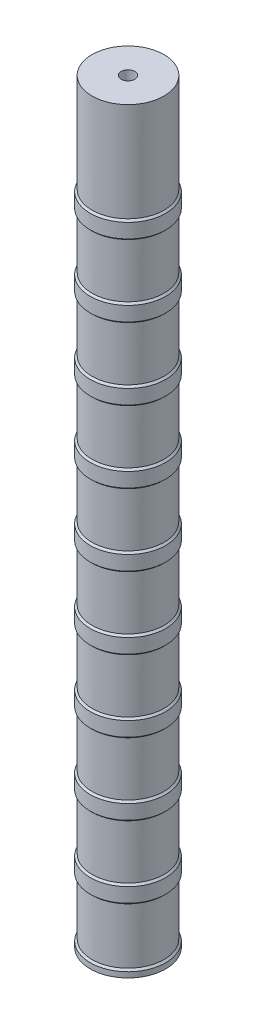
ISO-10303-21;
HEADER;
FILE_DESCRIPTION(('STEP AP214'),'2;1');
FILE_NAME('part.step','',(''),(''),'','','');
FILE_SCHEMA(('AUTOMOTIVE_DESIGN { 1 0 10303 214 1 1 1 1 }'));
ENDSEC;
DATA;
#1=APPLICATION_CONTEXT('core data for automotive mechanical design processes');
#2=APPLICATION_PROTOCOL_DEFINITION('international standard','automotive_design',2000,#1);
#3=PRODUCT_CONTEXT('',#1,'mechanical');
#4=PRODUCT('Part','Part','',(#3));
#5=PRODUCT_RELATED_PRODUCT_CATEGORY('part','',(#4));
#6=PRODUCT_DEFINITION_FORMATION('','',#4);
#7=PRODUCT_DEFINITION_CONTEXT('part definition',#1,'design');
#8=PRODUCT_DEFINITION('design','',#6,#7);
#9=PRODUCT_DEFINITION_SHAPE('','',#8);
#10=(LENGTH_UNIT() NAMED_UNIT(*) SI_UNIT(.MILLI.,.METRE.));
#11=(NAMED_UNIT(*) PLANE_ANGLE_UNIT() SI_UNIT($,.RADIAN.));
#12=(NAMED_UNIT(*) SI_UNIT($,.STERADIAN.) SOLID_ANGLE_UNIT());
#13=UNCERTAINTY_MEASURE_WITH_UNIT(LENGTH_MEASURE(1.E-05),#10,'distance_accuracy_value','');
#14=(GEOMETRIC_REPRESENTATION_CONTEXT(3) GLOBAL_UNCERTAINTY_ASSIGNED_CONTEXT((#13)) GLOBAL_UNIT_ASSIGNED_CONTEXT((#10,
#11,#12)) REPRESENTATION_CONTEXT('',''));
#15=CARTESIAN_POINT('',(0.,0.,0.));
#16=DIRECTION('',(0.,0.,1.));
#17=DIRECTION('',(1.,0.,0.));
#18=AXIS2_PLACEMENT_3D('',#15,#16,#17);
#19=CARTESIAN_POINT('',(0.,210.,0.));
#20=DIRECTION('',(0.,-1.,0.));
#21=DIRECTION('',(0.,0.,-1.));
#22=AXIS2_PLACEMENT_3D('',#19,#20,#21);
#23=CYLINDRICAL_SURFACE('',#22,10.);
#24=CARTESIAN_POINT('',(0.,1.99999999999997,0.));
#25=DIRECTION('',(0.,-1.,0.));
#26=DIRECTION('',(0.,0.,-1.));
#27=AXIS2_PLACEMENT_3D('',#24,#25,#26);
#28=CIRCLE('',#27,10.);
#29=CARTESIAN_POINT('',(0.,1.99999999999997,-10.));
#30=VERTEX_POINT('',#29);
#31=EDGE_CURVE('E10',#30,#30,#28,.F.);
#32=ORIENTED_EDGE('',*,*,#31,.T.);
#33=EDGE_LOOP('',(#32));
#34=FACE_BOUND('',#33,.T.);
#35=CARTESIAN_POINT('',(0.,17.5,0.));
#36=DIRECTION('',(0.,-1.,0.));
#37=DIRECTION('',(0.,0.,-1.));
#38=AXIS2_PLACEMENT_3D('',#35,#36,#37);
#39=CIRCLE('',#38,10.);
#40=CARTESIAN_POINT('',(0.,17.5,-10.));
#41=VERTEX_POINT('',#40);
#42=EDGE_CURVE('E54',#41,#41,#39,.T.);
#43=ORIENTED_EDGE('',*,*,#42,.T.);
#44=EDGE_LOOP('',(#43));
#45=FACE_BOUND('',#44,.T.);
#46=ADVANCED_FACE('F38',(#34,#45),#23,.T.);
#47=CARTESIAN_POINT('',(0.,10.,0.));
#48=DIRECTION('',(0.,-1.,0.));
#49=DIRECTION('',(0.,0.,-1.));
#50=AXIS2_PLACEMENT_3D('',#47,#48,#49);
#51=CYLINDRICAL_SURFACE('',#50,5.2);
#52=CARTESIAN_POINT('',(0.,10.,0.));
#53=DIRECTION('',(0.,-1.,0.));
#54=DIRECTION('',(0.,0.,-1.));
#55=AXIS2_PLACEMENT_3D('',#52,#53,#54);
#56=CIRCLE('',#55,5.2);
#57=CARTESIAN_POINT('',(0.,10.,-5.2));
#58=VERTEX_POINT('',#57);
#59=EDGE_CURVE('E60',#58,#58,#56,.T.);
#60=ORIENTED_EDGE('',*,*,#59,.F.);
#61=EDGE_LOOP('',(#60));
#62=FACE_BOUND('',#61,.T.);
#63=CARTESIAN_POINT('',(0.,1.5,0.));
#64=DIRECTION('',(0.,-1.,0.));
#65=DIRECTION('',(0.,0.,-1.));
#66=AXIS2_PLACEMENT_3D('',#63,#64,#65);
#67=CIRCLE('',#66,5.2);
#68=CARTESIAN_POINT('',(0.,1.5,-5.2));
#69=VERTEX_POINT('',#68);
#70=EDGE_CURVE('E46',#69,#69,#67,.F.);
#71=ORIENTED_EDGE('',*,*,#70,.F.);
#72=EDGE_LOOP('',(#71));
#73=FACE_BOUND('',#72,.T.);
#74=ADVANCED_FACE('F211',(#62,#73),#51,.F.);
#75=CARTESIAN_POINT('',(0.,0.,0.));
#76=DIRECTION('',(0.,1.,0.));
#77=DIRECTION('',(0.,0.,1.));
#78=AXIS2_PLACEMENT_3D('',#75,#76,#77);
#79=CYLINDRICAL_SURFACE('',#78,1.9);
#80=CARTESIAN_POINT('',(0.,210.,0.));
#81=DIRECTION('',(0.,1.,0.));
#82=DIRECTION('',(0.,0.,1.));
#83=AXIS2_PLACEMENT_3D('',#80,#81,#82);
#84=CIRCLE('',#83,1.9);
#85=CARTESIAN_POINT('',(0.,210.,1.9));
#86=VERTEX_POINT('',#85);
#87=EDGE_CURVE('E59',#86,#86,#84,.T.);
#88=ORIENTED_EDGE('',*,*,#87,.T.);
#89=EDGE_LOOP('',(#88));
#90=FACE_BOUND('',#89,.T.);
#91=CARTESIAN_POINT('',(0.,10.,0.));
#92=DIRECTION('',(0.,-1.,0.));
#93=DIRECTION('',(0.,0.,-1.));
#94=AXIS2_PLACEMENT_3D('',#91,#92,#93);
#95=CIRCLE('',#94,1.9);
#96=CARTESIAN_POINT('',(0.,10.,-1.9));
#97=VERTEX_POINT('',#96);
#98=EDGE_CURVE('E57',#97,#97,#95,.F.);
#99=ORIENTED_EDGE('',*,*,#98,.F.);
#100=EDGE_LOOP('',(#99));
#101=FACE_BOUND('',#100,.T.);
#102=ADVANCED_FACE('F218',(#90,#101),#79,.F.);
#103=CARTESIAN_POINT('',(0.,162.5,0.));
#104=DIRECTION('',(0.,-1.,0.));
#105=DIRECTION('',(0.,0.,-1.));
#106=AXIS2_PLACEMENT_3D('',#103,#104,#105);
#107=CIRCLE('',#106,10.);
#108=CARTESIAN_POINT('',(0.,162.5,-10.));
#109=VERTEX_POINT('',#108);
#110=EDGE_CURVE('E118',#109,#109,#107,.F.);
#111=ORIENTED_EDGE('',*,*,#110,.T.);
#112=EDGE_LOOP('',(#111));
#113=FACE_BOUND('',#112,.T.);
#114=CARTESIAN_POINT('',(0.,177.5,0.));
#115=DIRECTION('',(0.,-1.,0.));
#116=DIRECTION('',(0.,0.,-1.));
#117=AXIS2_PLACEMENT_3D('',#114,#115,#116);
#118=CIRCLE('',#117,10.);
#119=CARTESIAN_POINT('',(0.,177.5,-10.));
#120=VERTEX_POINT('',#119);
#121=EDGE_CURVE('E109',#120,#120,#118,.T.);
#122=ORIENTED_EDGE('',*,*,#121,.T.);
#123=EDGE_LOOP('',(#122));
#124=FACE_BOUND('',#123,.T.);
#125=ADVANCED_FACE('F213',(#113,#124),#23,.T.);
#126=CARTESIAN_POINT('',(0.,142.5,0.));
#127=DIRECTION('',(0.,-1.,0.));
#128=DIRECTION('',(0.,0.,-1.));
#129=AXIS2_PLACEMENT_3D('',#126,#127,#128);
#130=CIRCLE('',#129,10.);
#131=CARTESIAN_POINT('',(0.,142.5,-10.));
#132=VERTEX_POINT('',#131);
#133=EDGE_CURVE('E130',#132,#132,#130,.F.);
#134=ORIENTED_EDGE('',*,*,#133,.T.);
#135=EDGE_LOOP('',(#134));
#136=FACE_BOUND('',#135,.T.);
#137=CARTESIAN_POINT('',(0.,157.5,0.));
#138=DIRECTION('',(0.,-1.,0.));
#139=DIRECTION('',(0.,0.,-1.));
#140=AXIS2_PLACEMENT_3D('',#137,#138,#139);
#141=CIRCLE('',#140,10.);
#142=CARTESIAN_POINT('',(0.,157.5,-10.));
#143=VERTEX_POINT('',#142);
#144=EDGE_CURVE('E121',#143,#143,#141,.T.);
#145=ORIENTED_EDGE('',*,*,#144,.T.);
#146=EDGE_LOOP('',(#145));
#147=FACE_BOUND('',#146,.T.);
#148=ADVANCED_FACE('F224',(#136,#147),#23,.T.);
#149=CARTESIAN_POINT('',(0.,122.5,0.));
#150=DIRECTION('',(0.,-1.,0.));
#151=DIRECTION('',(0.,0.,-1.));
#152=AXIS2_PLACEMENT_3D('',#149,#150,#151);
#153=CIRCLE('',#152,10.);
#154=CARTESIAN_POINT('',(0.,122.5,-10.));
#155=VERTEX_POINT('',#154);
#156=EDGE_CURVE('E142',#155,#155,#153,.F.);
#157=ORIENTED_EDGE('',*,*,#156,.T.);
#158=EDGE_LOOP('',(#157));
#159=FACE_BOUND('',#158,.T.);
#160=CARTESIAN_POINT('',(0.,137.5,0.));
#161=DIRECTION('',(0.,-1.,0.));
#162=DIRECTION('',(0.,0.,-1.));
#163=AXIS2_PLACEMENT_3D('',#160,#161,#162);
#164=CIRCLE('',#163,10.);
#165=CARTESIAN_POINT('',(0.,137.5,-10.));
#166=VERTEX_POINT('',#165);
#167=EDGE_CURVE('E133',#166,#166,#164,.T.);
#168=ORIENTED_EDGE('',*,*,#167,.T.);
#169=EDGE_LOOP('',(#168));
#170=FACE_BOUND('',#169,.T.);
#171=ADVANCED_FACE('F683',(#159,#170),#23,.T.);
#172=CARTESIAN_POINT('',(0.,102.5,0.));
#173=DIRECTION('',(0.,-1.,0.));
#174=DIRECTION('',(0.,0.,-1.));
#175=AXIS2_PLACEMENT_3D('',#172,#173,#174);
#176=CIRCLE('',#175,10.);
#177=CARTESIAN_POINT('',(0.,102.5,-10.));
#178=VERTEX_POINT('',#177);
#179=EDGE_CURVE('E163',#178,#178,#176,.F.);
#180=ORIENTED_EDGE('',*,*,#179,.T.);
#181=EDGE_LOOP('',(#180));
#182=FACE_BOUND('',#181,.T.);
#183=CARTESIAN_POINT('',(0.,117.5,0.));
#184=DIRECTION('',(0.,-1.,0.));
#185=DIRECTION('',(0.,0.,-1.));
#186=AXIS2_PLACEMENT_3D('',#183,#184,#185);
#187=CIRCLE('',#186,10.);
#188=CARTESIAN_POINT('',(0.,117.5,-10.));
#189=VERTEX_POINT('',#188);
#190=EDGE_CURVE('E145',#189,#189,#187,.T.);
#191=ORIENTED_EDGE('',*,*,#190,.T.);
#192=EDGE_LOOP('',(#191));
#193=FACE_BOUND('',#192,.T.);
#194=ADVANCED_FACE('F673',(#182,#193),#23,.T.);
#195=CARTESIAN_POINT('',(0.,62.5,0.));
#196=DIRECTION('',(0.,-1.,0.));
#197=DIRECTION('',(0.,0.,-1.));
#198=AXIS2_PLACEMENT_3D('',#195,#196,#197);
#199=CIRCLE('',#198,10.);
#200=CARTESIAN_POINT('',(0.,62.5,-10.));
#201=VERTEX_POINT('',#200);
#202=EDGE_CURVE('E82',#201,#201,#199,.F.);
#203=ORIENTED_EDGE('',*,*,#202,.T.);
#204=EDGE_LOOP('',(#203));
#205=FACE_BOUND('',#204,.T.);
#206=CARTESIAN_POINT('',(0.,77.5,0.));
#207=DIRECTION('',(0.,-1.,0.));
#208=DIRECTION('',(0.,0.,-1.));
#209=AXIS2_PLACEMENT_3D('',#206,#207,#208);
#210=CIRCLE('',#209,10.);
#211=CARTESIAN_POINT('',(0.,77.5,-10.));
#212=VERTEX_POINT('',#211);
#213=EDGE_CURVE('E97',#212,#212,#210,.T.);
#214=ORIENTED_EDGE('',*,*,#213,.T.);
#215=EDGE_LOOP('',(#214));
#216=FACE_BOUND('',#215,.T.);
#217=ADVANCED_FACE('F265',(#205,#216),#23,.T.);
#218=CARTESIAN_POINT('',(0.,42.5,0.));
#219=DIRECTION('',(0.,-1.,0.));
#220=DIRECTION('',(0.,0.,-1.));
#221=AXIS2_PLACEMENT_3D('',#218,#219,#220);
#222=CIRCLE('',#221,10.);
#223=CARTESIAN_POINT('',(0.,42.5,-10.));
#224=VERTEX_POINT('',#223);
#225=EDGE_CURVE('E70',#224,#224,#222,.F.);
#226=ORIENTED_EDGE('',*,*,#225,.T.);
#227=EDGE_LOOP('',(#226));
#228=FACE_BOUND('',#227,.T.);
#229=CARTESIAN_POINT('',(0.,57.5,0.));
#230=DIRECTION('',(0.,-1.,0.));
#231=DIRECTION('',(0.,0.,-1.));
#232=AXIS2_PLACEMENT_3D('',#229,#230,#231);
#233=CIRCLE('',#232,10.);
#234=CARTESIAN_POINT('',(0.,57.5,-10.));
#235=VERTEX_POINT('',#234);
#236=EDGE_CURVE('E85',#235,#235,#233,.T.);
#237=ORIENTED_EDGE('',*,*,#236,.T.);
#238=EDGE_LOOP('',(#237));
#239=FACE_BOUND('',#238,.T.);
#240=ADVANCED_FACE('F257',(#228,#239),#23,.T.);
#241=CARTESIAN_POINT('',(0.,22.5,0.));
#242=DIRECTION('',(0.,-1.,0.));
#243=DIRECTION('',(0.,0.,-1.));
#244=AXIS2_PLACEMENT_3D('',#241,#242,#243);
#245=CIRCLE('',#244,10.);
#246=CARTESIAN_POINT('',(0.,22.5,-10.));
#247=VERTEX_POINT('',#246);
#248=EDGE_CURVE('E50',#247,#247,#245,.F.);
#249=ORIENTED_EDGE('',*,*,#248,.T.);
#250=EDGE_LOOP('',(#249));
#251=FACE_BOUND('',#250,.T.);
#252=CARTESIAN_POINT('',(0.,37.5,0.));
#253=DIRECTION('',(0.,-1.,0.));
#254=DIRECTION('',(0.,0.,-1.));
#255=AXIS2_PLACEMENT_3D('',#252,#253,#254);
#256=CIRCLE('',#255,10.);
#257=CARTESIAN_POINT('',(0.,37.5,-10.));
#258=VERTEX_POINT('',#257);
#259=EDGE_CURVE('E73',#258,#258,#256,.T.);
#260=ORIENTED_EDGE('',*,*,#259,.T.);
#261=EDGE_LOOP('',(#260));
#262=FACE_BOUND('',#261,.T.);
#263=ADVANCED_FACE('F245',(#251,#262),#23,.T.);
#264=CARTESIAN_POINT('',(0.,21.5,0.));
#265=DIRECTION('',(0.,-1.,0.));
#266=DIRECTION('',(0.,0.,-1.));
#267=AXIS2_PLACEMENT_3D('',#264,#265,#266);
#268=CONICAL_SURFACE('',#267,11.,0.785398163397457);
#269=ORIENTED_EDGE('',*,*,#248,.F.);
#270=EDGE_LOOP('',(#269));
#271=FACE_BOUND('',#270,.T.);
#272=CARTESIAN_POINT('',(0.,22.,0.));
#273=DIRECTION('',(0.,-1.,0.));
#274=DIRECTION('',(0.,0.,-1.));
#275=AXIS2_PLACEMENT_3D('',#272,#273,#274);
#276=CIRCLE('',#275,10.5);
#277=CARTESIAN_POINT('',(0.,22.,-10.5));
#278=VERTEX_POINT('',#277);
#279=EDGE_CURVE('E64',#278,#278,#276,.T.);
#280=ORIENTED_EDGE('',*,*,#279,.F.);
#281=EDGE_LOOP('',(#280));
#282=FACE_BOUND('',#281,.T.);
#283=ADVANCED_FACE('F256',(#271,#282),#268,.T.);
#284=CARTESIAN_POINT('',(0.,17.5,0.));
#285=DIRECTION('',(0.,1.,0.));
#286=DIRECTION('',(0.,0.,1.));
#287=AXIS2_PLACEMENT_3D('',#284,#285,#286);
#288=CONICAL_SURFACE('',#287,10.,0.785398163397445);
#289=CARTESIAN_POINT('',(0.,18.,0.));
#290=DIRECTION('',(0.,1.,0.));
#291=DIRECTION('',(0.,0.,1.));
#292=AXIS2_PLACEMENT_3D('',#289,#290,#291);
#293=CIRCLE('',#292,10.5);
#294=CARTESIAN_POINT('',(0.,18.,10.5));
#295=VERTEX_POINT('',#294);
#296=EDGE_CURVE('E67',#295,#295,#293,.T.);
#297=ORIENTED_EDGE('',*,*,#296,.F.);
#298=EDGE_LOOP('',(#297));
#299=FACE_BOUND('',#298,.T.);
#300=ORIENTED_EDGE('',*,*,#42,.F.);
#301=EDGE_LOOP('',(#300));
#302=FACE_BOUND('',#301,.T.);
#303=ADVANCED_FACE('F263',(#299,#302),#288,.T.);
#304=CARTESIAN_POINT('',(0.,18.5,0.));
#305=DIRECTION('',(0.,1.,0.));
#306=DIRECTION('',(0.,0.,1.));
#307=AXIS2_PLACEMENT_3D('',#304,#305,#306);
#308=CYLINDRICAL_SURFACE('',#307,10.5);
#309=ORIENTED_EDGE('',*,*,#296,.T.);
#310=EDGE_LOOP('',(#309));
#311=FACE_BOUND('',#310,.T.);
#312=ORIENTED_EDGE('',*,*,#279,.T.);
#313=EDGE_LOOP('',(#312));
#314=FACE_BOUND('',#313,.T.);
#315=ADVANCED_FACE('F284',(#311,#314),#308,.T.);
#316=CARTESIAN_POINT('',(0.,41.5,0.));
#317=DIRECTION('',(0.,-1.,0.));
#318=DIRECTION('',(0.,0.,-1.));
#319=AXIS2_PLACEMENT_3D('',#316,#317,#318);
#320=CONICAL_SURFACE('',#319,11.,0.785398163397457);
#321=ORIENTED_EDGE('',*,*,#225,.F.);
#322=EDGE_LOOP('',(#321));
#323=FACE_BOUND('',#322,.T.);
#324=CARTESIAN_POINT('',(0.,42.,0.));
#325=DIRECTION('',(0.,-1.,0.));
#326=DIRECTION('',(0.,0.,-1.));
#327=AXIS2_PLACEMENT_3D('',#324,#325,#326);
#328=CIRCLE('',#327,10.5);
#329=CARTESIAN_POINT('',(0.,42.,-10.5));
#330=VERTEX_POINT('',#329);
#331=EDGE_CURVE('E76',#330,#330,#328,.T.);
#332=ORIENTED_EDGE('',*,*,#331,.F.);
#333=EDGE_LOOP('',(#332));
#334=FACE_BOUND('',#333,.T.);
#335=ADVANCED_FACE('F274',(#323,#334),#320,.T.);
#336=CARTESIAN_POINT('',(0.,37.5,0.));
#337=DIRECTION('',(0.,1.,0.));
#338=DIRECTION('',(0.,0.,1.));
#339=AXIS2_PLACEMENT_3D('',#336,#337,#338);
#340=CONICAL_SURFACE('',#339,10.,0.785398163397445);
#341=CARTESIAN_POINT('',(0.,38.,0.));
#342=DIRECTION('',(0.,1.,0.));
#343=DIRECTION('',(0.,0.,1.));
#344=AXIS2_PLACEMENT_3D('',#341,#342,#343);
#345=CIRCLE('',#344,10.5);
#346=CARTESIAN_POINT('',(0.,38.,10.5));
#347=VERTEX_POINT('',#346);
#348=EDGE_CURVE('E79',#347,#347,#345,.T.);
#349=ORIENTED_EDGE('',*,*,#348,.F.);
#350=EDGE_LOOP('',(#349));
#351=FACE_BOUND('',#350,.T.);
#352=ORIENTED_EDGE('',*,*,#259,.F.);
#353=EDGE_LOOP('',(#352));
#354=FACE_BOUND('',#353,.T.);
#355=ADVANCED_FACE('F271',(#351,#354),#340,.T.);
#356=CARTESIAN_POINT('',(0.,38.5,0.));
#357=DIRECTION('',(0.,1.,0.));
#358=DIRECTION('',(0.,0.,1.));
#359=AXIS2_PLACEMENT_3D('',#356,#357,#358);
#360=CYLINDRICAL_SURFACE('',#359,10.5);
#361=ORIENTED_EDGE('',*,*,#348,.T.);
#362=EDGE_LOOP('',(#361));
#363=FACE_BOUND('',#362,.T.);
#364=ORIENTED_EDGE('',*,*,#331,.T.);
#365=EDGE_LOOP('',(#364));
#366=FACE_BOUND('',#365,.T.);
#367=ADVANCED_FACE('F273',(#363,#366),#360,.T.);
#368=CARTESIAN_POINT('',(0.,61.5,0.));
#369=DIRECTION('',(0.,-1.,0.));
#370=DIRECTION('',(0.,0.,-1.));
#371=AXIS2_PLACEMENT_3D('',#368,#369,#370);
#372=CONICAL_SURFACE('',#371,11.,0.785398163397457);
#373=ORIENTED_EDGE('',*,*,#202,.F.);
#374=EDGE_LOOP('',(#373));
#375=FACE_BOUND('',#374,.T.);
#376=CARTESIAN_POINT('',(0.,62.,0.));
#377=DIRECTION('',(0.,-1.,0.));
#378=DIRECTION('',(0.,0.,-1.));
#379=AXIS2_PLACEMENT_3D('',#376,#377,#378);
#380=CIRCLE('',#379,10.5);
#381=CARTESIAN_POINT('',(0.,62.,-10.5));
#382=VERTEX_POINT('',#381);
#383=EDGE_CURVE('E88',#382,#382,#380,.T.);
#384=ORIENTED_EDGE('',*,*,#383,.F.);
#385=EDGE_LOOP('',(#384));
#386=FACE_BOUND('',#385,.T.);
#387=ADVANCED_FACE('F281',(#375,#386),#372,.T.);
#388=CARTESIAN_POINT('',(0.,57.5,0.));
#389=DIRECTION('',(0.,1.,0.));
#390=DIRECTION('',(0.,0.,1.));
#391=AXIS2_PLACEMENT_3D('',#388,#389,#390);
#392=CONICAL_SURFACE('',#391,10.,0.785398163397445);
#393=CARTESIAN_POINT('',(0.,58.,0.));
#394=DIRECTION('',(0.,1.,0.));
#395=DIRECTION('',(0.,0.,1.));
#396=AXIS2_PLACEMENT_3D('',#393,#394,#395);
#397=CIRCLE('',#396,10.5);
#398=CARTESIAN_POINT('',(0.,58.,10.5));
#399=VERTEX_POINT('',#398);
#400=EDGE_CURVE('E91',#399,#399,#397,.T.);
#401=ORIENTED_EDGE('',*,*,#400,.F.);
#402=EDGE_LOOP('',(#401));
#403=FACE_BOUND('',#402,.T.);
#404=ORIENTED_EDGE('',*,*,#236,.F.);
#405=EDGE_LOOP('',(#404));
#406=FACE_BOUND('',#405,.T.);
#407=ADVANCED_FACE('F350',(#403,#406),#392,.T.);
#408=CARTESIAN_POINT('',(0.,58.5,0.));
#409=DIRECTION('',(0.,1.,0.));
#410=DIRECTION('',(0.,0.,1.));
#411=AXIS2_PLACEMENT_3D('',#408,#409,#410);
#412=CYLINDRICAL_SURFACE('',#411,10.5);
#413=ORIENTED_EDGE('',*,*,#400,.T.);
#414=EDGE_LOOP('',(#413));
#415=FACE_BOUND('',#414,.T.);
#416=ORIENTED_EDGE('',*,*,#383,.T.);
#417=EDGE_LOOP('',(#416));
#418=FACE_BOUND('',#417,.T.);
#419=ADVANCED_FACE('F360',(#415,#418),#412,.T.);
#420=CARTESIAN_POINT('',(0.,81.5,0.));
#421=DIRECTION('',(0.,-1.,0.));
#422=DIRECTION('',(0.,0.,-1.));
#423=AXIS2_PLACEMENT_3D('',#420,#421,#422);
#424=CONICAL_SURFACE('',#423,11.,0.785398163397457);
#425=CARTESIAN_POINT('',(0.,82.5,0.));
#426=DIRECTION('',(0.,-1.,0.));
#427=DIRECTION('',(0.,0.,-1.));
#428=AXIS2_PLACEMENT_3D('',#425,#426,#427);
#429=CIRCLE('',#428,10.);
#430=CARTESIAN_POINT('',(0.,82.5,-10.));
#431=VERTEX_POINT('',#430);
#432=EDGE_CURVE('E94',#431,#431,#429,.F.);
#433=ORIENTED_EDGE('',*,*,#432,.F.);
#434=EDGE_LOOP('',(#433));
#435=FACE_BOUND('',#434,.T.);
#436=CARTESIAN_POINT('',(0.,82.,0.));
#437=DIRECTION('',(0.,-1.,0.));
#438=DIRECTION('',(0.,0.,-1.));
#439=AXIS2_PLACEMENT_3D('',#436,#437,#438);
#440=CIRCLE('',#439,10.5);
#441=CARTESIAN_POINT('',(0.,82.,-10.5));
#442=VERTEX_POINT('',#441);
#443=EDGE_CURVE('E100',#442,#442,#440,.T.);
#444=ORIENTED_EDGE('',*,*,#443,.F.);
#445=EDGE_LOOP('',(#444));
#446=FACE_BOUND('',#445,.T.);
#447=ADVANCED_FACE('F371',(#435,#446),#424,.T.);
#448=CARTESIAN_POINT('',(0.,77.5,0.));
#449=DIRECTION('',(0.,1.,0.));
#450=DIRECTION('',(0.,0.,1.));
#451=AXIS2_PLACEMENT_3D('',#448,#449,#450);
#452=CONICAL_SURFACE('',#451,10.,0.785398163397445);
#453=CARTESIAN_POINT('',(0.,78.,0.));
#454=DIRECTION('',(0.,1.,0.));
#455=DIRECTION('',(0.,0.,1.));
#456=AXIS2_PLACEMENT_3D('',#453,#454,#455);
#457=CIRCLE('',#456,10.5);
#458=CARTESIAN_POINT('',(0.,78.,10.5));
#459=VERTEX_POINT('',#458);
#460=EDGE_CURVE('E103',#459,#459,#457,.T.);
#461=ORIENTED_EDGE('',*,*,#460,.F.);
#462=EDGE_LOOP('',(#461));
#463=FACE_BOUND('',#462,.T.);
#464=ORIENTED_EDGE('',*,*,#213,.F.);
#465=EDGE_LOOP('',(#464));
#466=FACE_BOUND('',#465,.T.);
#467=ADVANCED_FACE('F382',(#463,#466),#452,.T.);
#468=CARTESIAN_POINT('',(0.,78.5,0.));
#469=DIRECTION('',(0.,1.,0.));
#470=DIRECTION('',(0.,0.,1.));
#471=AXIS2_PLACEMENT_3D('',#468,#469,#470);
#472=CYLINDRICAL_SURFACE('',#471,10.5);
#473=ORIENTED_EDGE('',*,*,#460,.T.);
#474=EDGE_LOOP('',(#473));
#475=FACE_BOUND('',#474,.T.);
#476=ORIENTED_EDGE('',*,*,#443,.T.);
#477=EDGE_LOOP('',(#476));
#478=FACE_BOUND('',#477,.T.);
#479=ADVANCED_FACE('F393',(#475,#478),#472,.T.);
#480=CARTESIAN_POINT('',(0.,181.5,0.));
#481=DIRECTION('',(0.,-1.,0.));
#482=DIRECTION('',(0.,0.,-1.));
#483=AXIS2_PLACEMENT_3D('',#480,#481,#482);
#484=CONICAL_SURFACE('',#483,11.,0.785398163397457);
#485=CARTESIAN_POINT('',(0.,182.5,0.));
#486=DIRECTION('',(0.,-1.,0.));
#487=DIRECTION('',(0.,0.,-1.));
#488=AXIS2_PLACEMENT_3D('',#485,#486,#487);
#489=CIRCLE('',#488,10.);
#490=CARTESIAN_POINT('',(0.,182.5,-10.));
#491=VERTEX_POINT('',#490);
#492=EDGE_CURVE('E106',#491,#491,#489,.F.);
#493=ORIENTED_EDGE('',*,*,#492,.F.);
#494=EDGE_LOOP('',(#493));
#495=FACE_BOUND('',#494,.T.);
#496=CARTESIAN_POINT('',(0.,182.,0.));
#497=DIRECTION('',(0.,-1.,0.));
#498=DIRECTION('',(0.,0.,-1.));
#499=AXIS2_PLACEMENT_3D('',#496,#497,#498);
#500=CIRCLE('',#499,10.5);
#501=CARTESIAN_POINT('',(0.,182.,-10.5));
#502=VERTEX_POINT('',#501);
#503=EDGE_CURVE('E112',#502,#502,#500,.T.);
#504=ORIENTED_EDGE('',*,*,#503,.F.);
#505=EDGE_LOOP('',(#504));
#506=FACE_BOUND('',#505,.T.);
#507=ADVANCED_FACE('F404',(#495,#506),#484,.T.);
#508=CARTESIAN_POINT('',(0.,177.5,0.));
#509=DIRECTION('',(0.,1.,0.));
#510=DIRECTION('',(0.,0.,1.));
#511=AXIS2_PLACEMENT_3D('',#508,#509,#510);
#512=CONICAL_SURFACE('',#511,10.,0.785398163397445);
#513=CARTESIAN_POINT('',(0.,178.,0.));
#514=DIRECTION('',(0.,1.,0.));
#515=DIRECTION('',(0.,0.,1.));
#516=AXIS2_PLACEMENT_3D('',#513,#514,#515);
#517=CIRCLE('',#516,10.5);
#518=CARTESIAN_POINT('',(0.,178.,10.5));
#519=VERTEX_POINT('',#518);
#520=EDGE_CURVE('E115',#519,#519,#517,.T.);
#521=ORIENTED_EDGE('',*,*,#520,.F.);
#522=EDGE_LOOP('',(#521));
#523=FACE_BOUND('',#522,.T.);
#524=ORIENTED_EDGE('',*,*,#121,.F.);
#525=EDGE_LOOP('',(#524));
#526=FACE_BOUND('',#525,.T.);
#527=ADVANCED_FACE('F415',(#523,#526),#512,.T.);
#528=CARTESIAN_POINT('',(0.,178.5,0.));
#529=DIRECTION('',(0.,1.,0.));
#530=DIRECTION('',(0.,0.,1.));
#531=AXIS2_PLACEMENT_3D('',#528,#529,#530);
#532=CYLINDRICAL_SURFACE('',#531,10.5);
#533=ORIENTED_EDGE('',*,*,#520,.T.);
#534=EDGE_LOOP('',(#533));
#535=FACE_BOUND('',#534,.T.);
#536=ORIENTED_EDGE('',*,*,#503,.T.);
#537=EDGE_LOOP('',(#536));
#538=FACE_BOUND('',#537,.T.);
#539=ADVANCED_FACE('F426',(#535,#538),#532,.T.);
#540=CARTESIAN_POINT('',(0.,161.5,0.));
#541=DIRECTION('',(0.,-1.,0.));
#542=DIRECTION('',(0.,0.,-1.));
#543=AXIS2_PLACEMENT_3D('',#540,#541,#542);
#544=CONICAL_SURFACE('',#543,11.,0.785398163397457);
#545=ORIENTED_EDGE('',*,*,#110,.F.);
#546=EDGE_LOOP('',(#545));
#547=FACE_BOUND('',#546,.T.);
#548=CARTESIAN_POINT('',(0.,162.,0.));
#549=DIRECTION('',(0.,-1.,0.));
#550=DIRECTION('',(0.,0.,-1.));
#551=AXIS2_PLACEMENT_3D('',#548,#549,#550);
#552=CIRCLE('',#551,10.5);
#553=CARTESIAN_POINT('',(0.,162.,-10.5));
#554=VERTEX_POINT('',#553);
#555=EDGE_CURVE('E124',#554,#554,#552,.T.);
#556=ORIENTED_EDGE('',*,*,#555,.F.);
#557=EDGE_LOOP('',(#556));
#558=FACE_BOUND('',#557,.T.);
#559=ADVANCED_FACE('F437',(#547,#558),#544,.T.);
#560=CARTESIAN_POINT('',(0.,157.5,0.));
#561=DIRECTION('',(0.,1.,0.));
#562=DIRECTION('',(0.,0.,1.));
#563=AXIS2_PLACEMENT_3D('',#560,#561,#562);
#564=CONICAL_SURFACE('',#563,10.,0.785398163397445);
#565=CARTESIAN_POINT('',(0.,158.,0.));
#566=DIRECTION('',(0.,1.,0.));
#567=DIRECTION('',(0.,0.,1.));
#568=AXIS2_PLACEMENT_3D('',#565,#566,#567);
#569=CIRCLE('',#568,10.5);
#570=CARTESIAN_POINT('',(0.,158.,10.5));
#571=VERTEX_POINT('',#570);
#572=EDGE_CURVE('E127',#571,#571,#569,.T.);
#573=ORIENTED_EDGE('',*,*,#572,.F.);
#574=EDGE_LOOP('',(#573));
#575=FACE_BOUND('',#574,.T.);
#576=ORIENTED_EDGE('',*,*,#144,.F.);
#577=EDGE_LOOP('',(#576));
#578=FACE_BOUND('',#577,.T.);
#579=ADVANCED_FACE('F448',(#575,#578),#564,.T.);
#580=CARTESIAN_POINT('',(0.,158.5,0.));
#581=DIRECTION('',(0.,1.,0.));
#582=DIRECTION('',(0.,0.,1.));
#583=AXIS2_PLACEMENT_3D('',#580,#581,#582);
#584=CYLINDRICAL_SURFACE('',#583,10.5);
#585=ORIENTED_EDGE('',*,*,#572,.T.);
#586=EDGE_LOOP('',(#585));
#587=FACE_BOUND('',#586,.T.);
#588=ORIENTED_EDGE('',*,*,#555,.T.);
#589=EDGE_LOOP('',(#588));
#590=FACE_BOUND('',#589,.T.);
#591=ADVANCED_FACE('F459',(#587,#590),#584,.T.);
#592=CARTESIAN_POINT('',(0.,141.5,0.));
#593=DIRECTION('',(0.,-1.,0.));
#594=DIRECTION('',(0.,0.,-1.));
#595=AXIS2_PLACEMENT_3D('',#592,#593,#594);
#596=CONICAL_SURFACE('',#595,11.,0.785398163397457);
#597=ORIENTED_EDGE('',*,*,#133,.F.);
#598=EDGE_LOOP('',(#597));
#599=FACE_BOUND('',#598,.T.);
#600=CARTESIAN_POINT('',(0.,142.,0.));
#601=DIRECTION('',(0.,-1.,0.));
#602=DIRECTION('',(0.,0.,-1.));
#603=AXIS2_PLACEMENT_3D('',#600,#601,#602);
#604=CIRCLE('',#603,10.5);
#605=CARTESIAN_POINT('',(0.,142.,-10.5));
#606=VERTEX_POINT('',#605);
#607=EDGE_CURVE('E136',#606,#606,#604,.T.);
#608=ORIENTED_EDGE('',*,*,#607,.F.);
#609=EDGE_LOOP('',(#608));
#610=FACE_BOUND('',#609,.T.);
#611=ADVANCED_FACE('F470',(#599,#610),#596,.T.);
#612=CARTESIAN_POINT('',(0.,137.5,0.));
#613=DIRECTION('',(0.,1.,0.));
#614=DIRECTION('',(0.,0.,1.));
#615=AXIS2_PLACEMENT_3D('',#612,#613,#614);
#616=CONICAL_SURFACE('',#615,10.,0.785398163397445);
#617=CARTESIAN_POINT('',(0.,138.,0.));
#618=DIRECTION('',(0.,1.,0.));
#619=DIRECTION('',(0.,0.,1.));
#620=AXIS2_PLACEMENT_3D('',#617,#618,#619);
#621=CIRCLE('',#620,10.5);
#622=CARTESIAN_POINT('',(0.,138.,10.5));
#623=VERTEX_POINT('',#622);
#624=EDGE_CURVE('E139',#623,#623,#621,.T.);
#625=ORIENTED_EDGE('',*,*,#624,.F.);
#626=EDGE_LOOP('',(#625));
#627=FACE_BOUND('',#626,.T.);
#628=ORIENTED_EDGE('',*,*,#167,.F.);
#629=EDGE_LOOP('',(#628));
#630=FACE_BOUND('',#629,.T.);
#631=ADVANCED_FACE('F481',(#627,#630),#616,.T.);
#632=CARTESIAN_POINT('',(0.,138.5,0.));
#633=DIRECTION('',(0.,1.,0.));
#634=DIRECTION('',(0.,0.,1.));
#635=AXIS2_PLACEMENT_3D('',#632,#633,#634);
#636=CYLINDRICAL_SURFACE('',#635,10.5);
#637=ORIENTED_EDGE('',*,*,#624,.T.);
#638=EDGE_LOOP('',(#637));
#639=FACE_BOUND('',#638,.T.);
#640=ORIENTED_EDGE('',*,*,#607,.T.);
#641=EDGE_LOOP('',(#640));
#642=FACE_BOUND('',#641,.T.);
#643=ADVANCED_FACE('F492',(#639,#642),#636,.T.);
#644=CARTESIAN_POINT('',(0.,121.5,0.));
#645=DIRECTION('',(0.,-1.,0.));
#646=DIRECTION('',(0.,0.,-1.));
#647=AXIS2_PLACEMENT_3D('',#644,#645,#646);
#648=CONICAL_SURFACE('',#647,11.,0.785398163397457);
#649=ORIENTED_EDGE('',*,*,#156,.F.);
#650=EDGE_LOOP('',(#649));
#651=FACE_BOUND('',#650,.T.);
#652=CARTESIAN_POINT('',(0.,122.,0.));
#653=DIRECTION('',(0.,-1.,0.));
#654=DIRECTION('',(0.,0.,-1.));
#655=AXIS2_PLACEMENT_3D('',#652,#653,#654);
#656=CIRCLE('',#655,10.5);
#657=CARTESIAN_POINT('',(0.,122.,-10.5));
#658=VERTEX_POINT('',#657);
#659=EDGE_CURVE('E148',#658,#658,#656,.T.);
#660=ORIENTED_EDGE('',*,*,#659,.F.);
#661=EDGE_LOOP('',(#660));
#662=FACE_BOUND('',#661,.T.);
#663=ADVANCED_FACE('F503',(#651,#662),#648,.T.);
#664=CARTESIAN_POINT('',(0.,117.5,0.));
#665=DIRECTION('',(0.,1.,0.));
#666=DIRECTION('',(0.,0.,1.));
#667=AXIS2_PLACEMENT_3D('',#664,#665,#666);
#668=CONICAL_SURFACE('',#667,10.,0.785398163397445);
#669=CARTESIAN_POINT('',(0.,118.,0.));
#670=DIRECTION('',(0.,1.,0.));
#671=DIRECTION('',(0.,0.,1.));
#672=AXIS2_PLACEMENT_3D('',#669,#670,#671);
#673=CIRCLE('',#672,10.5);
#674=CARTESIAN_POINT('',(0.,118.,10.5));
#675=VERTEX_POINT('',#674);
#676=EDGE_CURVE('E151',#675,#675,#673,.T.);
#677=ORIENTED_EDGE('',*,*,#676,.F.);
#678=EDGE_LOOP('',(#677));
#679=FACE_BOUND('',#678,.T.);
#680=ORIENTED_EDGE('',*,*,#190,.F.);
#681=EDGE_LOOP('',(#680));
#682=FACE_BOUND('',#681,.T.);
#683=ADVANCED_FACE('F238',(#679,#682),#668,.T.);
#684=CARTESIAN_POINT('',(0.,118.5,0.));
#685=DIRECTION('',(0.,1.,0.));
#686=DIRECTION('',(0.,0.,1.));
#687=AXIS2_PLACEMENT_3D('',#684,#685,#686);
#688=CYLINDRICAL_SURFACE('',#687,10.5);
#689=ORIENTED_EDGE('',*,*,#676,.T.);
#690=EDGE_LOOP('',(#689));
#691=FACE_BOUND('',#690,.T.);
#692=ORIENTED_EDGE('',*,*,#659,.T.);
#693=EDGE_LOOP('',(#692));
#694=FACE_BOUND('',#693,.T.);
#695=ADVANCED_FACE('F228',(#691,#694),#688,.T.);
#696=ORIENTED_EDGE('',*,*,#432,.T.);
#697=EDGE_LOOP('',(#696));
#698=FACE_BOUND('',#697,.T.);
#699=CARTESIAN_POINT('',(0.,97.5,0.));
#700=DIRECTION('',(0.,-1.,0.));
#701=DIRECTION('',(0.,0.,-1.));
#702=AXIS2_PLACEMENT_3D('',#699,#700,#701);
#703=CIRCLE('',#702,10.);
#704=CARTESIAN_POINT('',(0.,97.5,-10.));
#705=VERTEX_POINT('',#704);
#706=EDGE_CURVE('E160',#705,#705,#703,.T.);
#707=ORIENTED_EDGE('',*,*,#706,.T.);
#708=EDGE_LOOP('',(#707));
#709=FACE_BOUND('',#708,.T.);
#710=ADVANCED_FACE('F214',(#698,#709),#23,.T.);
#711=CARTESIAN_POINT('',(0.,98.5,0.));
#712=DIRECTION('',(0.,1.,0.));
#713=DIRECTION('',(0.,0.,1.));
#714=AXIS2_PLACEMENT_3D('',#711,#712,#713);
#715=CYLINDRICAL_SURFACE('',#714,10.5);
#716=CARTESIAN_POINT('',(0.,98.,0.));
#717=DIRECTION('',(0.,1.,0.));
#718=DIRECTION('',(0.,0.,1.));
#719=AXIS2_PLACEMENT_3D('',#716,#717,#718);
#720=CIRCLE('',#719,10.5);
#721=CARTESIAN_POINT('',(0.,98.,10.5));
#722=VERTEX_POINT('',#721);
#723=EDGE_CURVE('E154',#722,#722,#720,.T.);
#724=ORIENTED_EDGE('',*,*,#723,.T.);
#725=EDGE_LOOP('',(#724));
#726=FACE_BOUND('',#725,.T.);
#727=CARTESIAN_POINT('',(0.,102.,0.));
#728=DIRECTION('',(0.,-1.,0.));
#729=DIRECTION('',(0.,0.,-1.));
#730=AXIS2_PLACEMENT_3D('',#727,#728,#729);
#731=CIRCLE('',#730,10.5);
#732=CARTESIAN_POINT('',(0.,102.,-10.5));
#733=VERTEX_POINT('',#732);
#734=EDGE_CURVE('E157',#733,#733,#731,.T.);
#735=ORIENTED_EDGE('',*,*,#734,.T.);
#736=EDGE_LOOP('',(#735));
#737=FACE_BOUND('',#736,.T.);
#738=ADVANCED_FACE('F227',(#726,#737),#715,.T.);
#739=CARTESIAN_POINT('',(0.,210.,0.));
#740=DIRECTION('',(0.,1.,0.));
#741=DIRECTION('',(0.,0.,1.));
#742=AXIS2_PLACEMENT_3D('',#739,#740,#741);
#743=PLANE('',#742);
#744=ORIENTED_EDGE('',*,*,#87,.F.);
#745=EDGE_LOOP('',(#744));
#746=FACE_BOUND('',#745,.T.);
#747=CARTESIAN_POINT('',(0.,210.,0.));
#748=DIRECTION('',(0.,1.,0.));
#749=DIRECTION('',(0.,0.,1.));
#750=AXIS2_PLACEMENT_3D('',#747,#748,#749);
#751=CIRCLE('',#750,10.);
#752=CARTESIAN_POINT('',(0.,210.,10.));
#753=VERTEX_POINT('',#752);
#754=EDGE_CURVE('E166',#753,#753,#751,.T.);
#755=ORIENTED_EDGE('',*,*,#754,.T.);
#756=EDGE_LOOP('',(#755));
#757=FACE_BOUND('',#756,.T.);
#758=ADVANCED_FACE('F235',(#746,#757),#743,.T.);
#759=ORIENTED_EDGE('',*,*,#492,.T.);
#760=EDGE_LOOP('',(#759));
#761=FACE_BOUND('',#760,.T.);
#762=ORIENTED_EDGE('',*,*,#754,.F.);
#763=EDGE_LOOP('',(#762));
#764=FACE_BOUND('',#763,.T.);
#765=ADVANCED_FACE('F230',(#761,#764),#23,.T.);
#766=CARTESIAN_POINT('',(0.,101.5,0.));
#767=DIRECTION('',(0.,-1.,0.));
#768=DIRECTION('',(0.,0.,-1.));
#769=AXIS2_PLACEMENT_3D('',#766,#767,#768);
#770=CONICAL_SURFACE('',#769,11.,0.785398163397457);
#771=ORIENTED_EDGE('',*,*,#179,.F.);
#772=EDGE_LOOP('',(#771));
#773=FACE_BOUND('',#772,.T.);
#774=ORIENTED_EDGE('',*,*,#734,.F.);
#775=EDGE_LOOP('',(#774));
#776=FACE_BOUND('',#775,.T.);
#777=ADVANCED_FACE('F243',(#773,#776),#770,.T.);
#778=CARTESIAN_POINT('',(0.,97.5,0.));
#779=DIRECTION('',(0.,1.,0.));
#780=DIRECTION('',(0.,0.,1.));
#781=AXIS2_PLACEMENT_3D('',#778,#779,#780);
#782=CONICAL_SURFACE('',#781,10.,0.785398163397445);
#783=ORIENTED_EDGE('',*,*,#723,.F.);
#784=EDGE_LOOP('',(#783));
#785=FACE_BOUND('',#784,.T.);
#786=ORIENTED_EDGE('',*,*,#706,.F.);
#787=EDGE_LOOP('',(#786));
#788=FACE_BOUND('',#787,.T.);
#789=ADVANCED_FACE('F250',(#785,#788),#782,.T.);
#790=CARTESIAN_POINT('',(0.,10.,0.));
#791=DIRECTION('',(0.,-1.,0.));
#792=DIRECTION('',(0.,0.,-1.));
#793=AXIS2_PLACEMENT_3D('',#790,#791,#792);
#794=PLANE('',#793);
#795=ORIENTED_EDGE('',*,*,#59,.T.);
#796=EDGE_LOOP('',(#795));
#797=FACE_BOUND('',#796,.T.);
#798=ORIENTED_EDGE('',*,*,#98,.T.);
#799=EDGE_LOOP('',(#798));
#800=FACE_BOUND('',#799,.T.);
#801=ADVANCED_FACE('F567',(#797,#800),#794,.T.);
#802=CARTESIAN_POINT('',(0.,1.5,0.));
#803=DIRECTION('',(0.,-1.,0.));
#804=DIRECTION('',(0.,0.,-1.));
#805=AXIS2_PLACEMENT_3D('',#802,#803,#804);
#806=PLANE('',#805);
#807=CARTESIAN_POINT('',(0.,1.5,0.));
#808=DIRECTION('',(0.,-1.,0.));
#809=DIRECTION('',(0.,0.,-1.));
#810=AXIS2_PLACEMENT_3D('',#807,#808,#809);
#811=CIRCLE('',#810,5.);
#812=CARTESIAN_POINT('',(0.,1.5,-5.));
#813=VERTEX_POINT('',#812);
#814=EDGE_CURVE('E177',#813,#813,#811,.T.);
#815=ORIENTED_EDGE('',*,*,#814,.T.);
#816=EDGE_LOOP('',(#815));
#817=FACE_BOUND('',#816,.T.);
#818=ORIENTED_EDGE('',*,*,#70,.T.);
#819=EDGE_LOOP('',(#818));
#820=FACE_BOUND('',#819,.T.);
#821=ADVANCED_FACE('F186',(#817,#820),#806,.F.);
#822=CARTESIAN_POINT('',(0.,1.5,0.));
#823=DIRECTION('',(0.,-1.,0.));
#824=DIRECTION('',(0.,0.,-1.));
#825=AXIS2_PLACEMENT_3D('',#822,#823,#824);
#826=CYLINDRICAL_SURFACE('',#825,5.);
#827=ORIENTED_EDGE('',*,*,#814,.F.);
#828=EDGE_LOOP('',(#827));
#829=FACE_BOUND('',#828,.T.);
#830=CARTESIAN_POINT('',(0.,0.,0.));
#831=DIRECTION('',(0.,-1.,0.));
#832=DIRECTION('',(0.,0.,-1.));
#833=AXIS2_PLACEMENT_3D('',#830,#831,#832);
#834=CIRCLE('',#833,5.);
#835=CARTESIAN_POINT('',(0.,0.,-5.));
#836=VERTEX_POINT('',#835);
#837=EDGE_CURVE('E180',#836,#836,#834,.T.);
#838=ORIENTED_EDGE('',*,*,#837,.T.);
#839=EDGE_LOOP('',(#838));
#840=FACE_BOUND('',#839,.T.);
#841=ADVANCED_FACE('F188',(#829,#840),#826,.F.);
#842=CARTESIAN_POINT('',(0.,0.,0.));
#843=DIRECTION('',(0.,1.,0.));
#844=DIRECTION('',(0.,0.,1.));
#845=AXIS2_PLACEMENT_3D('',#842,#843,#844);
#846=PLANE('',#845);
#847=ORIENTED_EDGE('',*,*,#837,.F.);
#848=EDGE_LOOP('',(#847));
#849=FACE_BOUND('',#848,.T.);
#850=CARTESIAN_POINT('',(0.,0.,0.));
#851=DIRECTION('',(0.,-1.,0.));
#852=DIRECTION('',(0.,0.,-1.));
#853=AXIS2_PLACEMENT_3D('',#850,#851,#852);
#854=CIRCLE('',#853,10.5);
#855=CARTESIAN_POINT('',(0.,0.,-10.5));
#856=VERTEX_POINT('',#855);
#857=EDGE_CURVE('E174',#856,#856,#854,.T.);
#858=ORIENTED_EDGE('',*,*,#857,.T.);
#859=EDGE_LOOP('',(#858));
#860=FACE_BOUND('',#859,.T.);
#861=ADVANCED_FACE('F191',(#849,#860),#846,.F.);
#862=CARTESIAN_POINT('',(0.,1.5,0.));
#863=DIRECTION('',(0.,-1.,0.));
#864=DIRECTION('',(0.,0.,-1.));
#865=AXIS2_PLACEMENT_3D('',#862,#863,#864);
#866=CYLINDRICAL_SURFACE('',#865,10.5);
#867=CARTESIAN_POINT('',(0.,1.5,0.));
#868=DIRECTION('',(0.,-1.,0.));
#869=DIRECTION('',(0.,0.,-1.));
#870=AXIS2_PLACEMENT_3D('',#867,#868,#869);
#871=CIRCLE('',#870,10.5);
#872=CARTESIAN_POINT('',(0.,1.5,-10.5));
#873=VERTEX_POINT('',#872);
#874=EDGE_CURVE('E173',#873,#873,#871,.T.);
#875=ORIENTED_EDGE('',*,*,#874,.T.);
#876=EDGE_LOOP('',(#875));
#877=FACE_BOUND('',#876,.T.);
#878=ORIENTED_EDGE('',*,*,#857,.F.);
#879=EDGE_LOOP('',(#878));
#880=FACE_BOUND('',#879,.T.);
#881=ADVANCED_FACE('F197',(#877,#880),#866,.T.);
#882=CARTESIAN_POINT('',(0.,1.5,0.));
#883=DIRECTION('',(0.,-1.,0.));
#884=DIRECTION('',(0.,0.,-1.));
#885=AXIS2_PLACEMENT_3D('',#882,#883,#884);
#886=CONICAL_SURFACE('',#885,10.5,0.785398163397457);
#887=ORIENTED_EDGE('',*,*,#31,.F.);
#888=EDGE_LOOP('',(#887));
#889=FACE_BOUND('',#888,.T.);
#890=ORIENTED_EDGE('',*,*,#874,.F.);
#891=EDGE_LOOP('',(#890));
#892=FACE_BOUND('',#891,.T.);
#893=ADVANCED_FACE('F41',(#889,#892),#886,.T.);
#894=CLOSED_SHELL('',(#46,#74,#102,#125,#148,#171,#194,#217,#240,#263,#283,#303,#315,#335,#355,
#367,#387,#407,#419,#447,#467,#479,#507,#527,#539,#559,#579,#591,#611,#631,#643,#663,#683,#695,
#710,#738,#758,#765,#777,#789,#801,#821,#841,#861,#881,#893));
#895=MANIFOLD_SOLID_BREP('B2',#894);
#896=ADVANCED_BREP_SHAPE_REPRESENTATION('',(#18,#895),#14);
#897=SHAPE_DEFINITION_REPRESENTATION(#9,#896);
ENDSEC;
END-ISO-10303-21;
